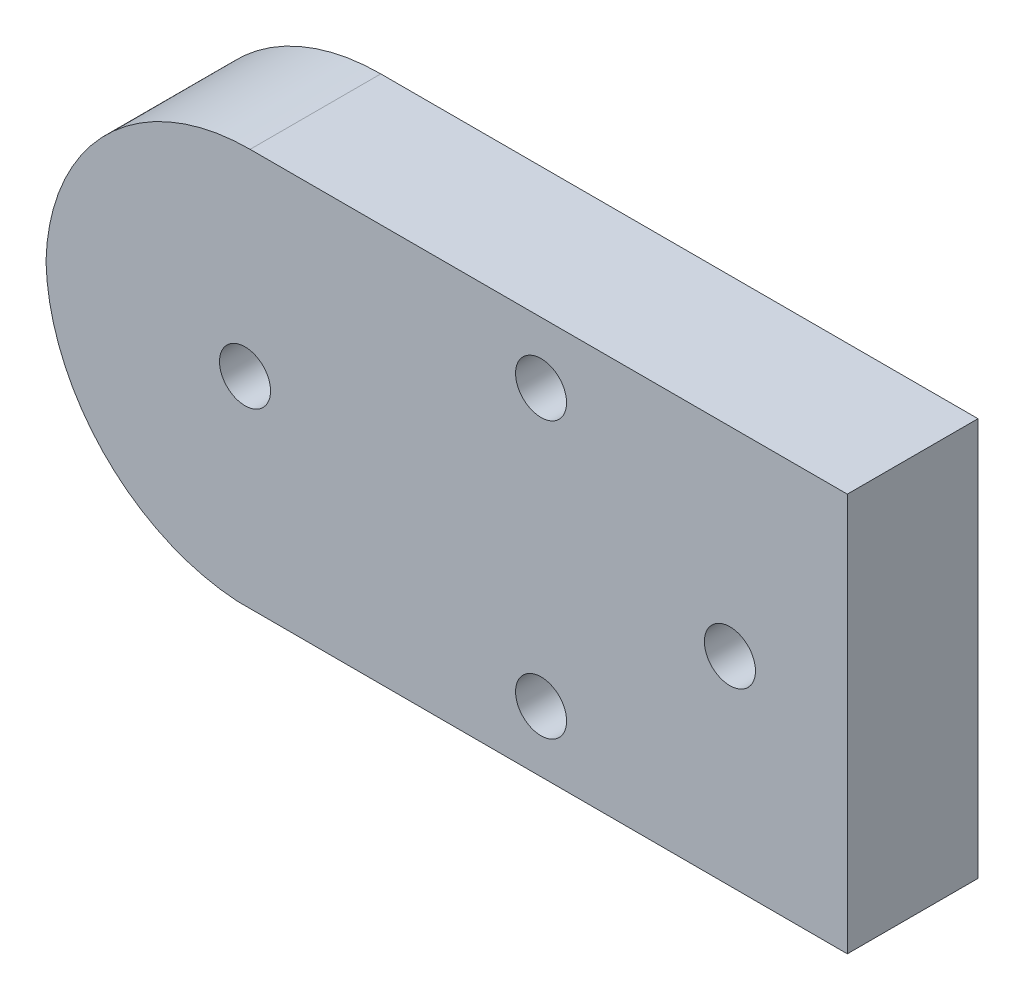
ISO-10303-21;
HEADER;
FILE_DESCRIPTION(('STEP AP214'),'2;1');
FILE_NAME('part.step','',(''),(''),'','','');
FILE_SCHEMA(('AUTOMOTIVE_DESIGN { 1 0 10303 214 1 1 1 1 }'));
ENDSEC;
DATA;
#1=APPLICATION_CONTEXT('core data for automotive mechanical design processes');
#2=APPLICATION_PROTOCOL_DEFINITION('international standard','automotive_design',2000,#1);
#3=PRODUCT_CONTEXT('',#1,'mechanical');
#4=PRODUCT('Part','Part','',(#3));
#5=PRODUCT_RELATED_PRODUCT_CATEGORY('part','',(#4));
#6=PRODUCT_DEFINITION_FORMATION('','',#4);
#7=PRODUCT_DEFINITION_CONTEXT('part definition',#1,'design');
#8=PRODUCT_DEFINITION('design','',#6,#7);
#9=PRODUCT_DEFINITION_SHAPE('','',#8);
#10=(LENGTH_UNIT() NAMED_UNIT(*) SI_UNIT(.MILLI.,.METRE.));
#11=(NAMED_UNIT(*) PLANE_ANGLE_UNIT() SI_UNIT($,.RADIAN.));
#12=(NAMED_UNIT(*) SI_UNIT($,.STERADIAN.) SOLID_ANGLE_UNIT());
#13=UNCERTAINTY_MEASURE_WITH_UNIT(LENGTH_MEASURE(1.E-05),#10,'distance_accuracy_value','');
#14=(GEOMETRIC_REPRESENTATION_CONTEXT(3) GLOBAL_UNCERTAINTY_ASSIGNED_CONTEXT((#13)) GLOBAL_UNIT_ASSIGNED_CONTEXT((#10,
#11,#12)) REPRESENTATION_CONTEXT('',''));
#15=CARTESIAN_POINT('',(0.,0.,0.));
#16=DIRECTION('',(0.,0.,1.));
#17=DIRECTION('',(1.,0.,0.));
#18=AXIS2_PLACEMENT_3D('',#15,#16,#17);
#19=CARTESIAN_POINT('',(0.,0.,4.));
#20=DIRECTION('',(0.,0.,1.));
#21=DIRECTION('',(1.,0.,0.));
#22=AXIS2_PLACEMENT_3D('',#19,#20,#21);
#23=PLANE('',#22);
#24=DIRECTION('',(1.,0.,0.));
#25=VECTOR('',#24,1.);
#26=CARTESIAN_POINT('',(0.,-9.75,4.));
#27=LINE('',#26,#25);
#28=CARTESIAN_POINT('',(0.25,-9.75,4.));
#29=VERTEX_POINT('',#28);
#30=CARTESIAN_POINT('',(29.5,-9.75,4.));
#31=VERTEX_POINT('',#30);
#32=EDGE_CURVE('E205',#29,#31,#27,.T.);
#33=ORIENTED_EDGE('',*,*,#32,.T.);
#34=DIRECTION('',(-0.999999767070476,0.000682538639031551,0.));
#35=VECTOR('',#34,1.);
#36=CARTESIAN_POINT('',(-0.00664100734015322,-9.72986057271339,4.));
#37=LINE('',#36,#35);
#38=CARTESIAN_POINT('',(-0.388423062468493,-9.72959999164838,4.));
#39=VERTEX_POINT('',#38);
#40=EDGE_CURVE('E143',#31,#39,#37,.T.);
#41=ORIENTED_EDGE('',*,*,#40,.T.);
#42=CARTESIAN_POINT('',(0.25,0.250000000000002,4.));
#43=DIRECTION('',(0.,0.,1.));
#44=DIRECTION('',(1.,0.,0.));
#45=AXIS2_PLACEMENT_3D('',#42,#43,#44);
#46=CIRCLE('',#45,10.);
#47=EDGE_CURVE('E57',#39,#29,#46,.T.);
#48=ORIENTED_EDGE('',*,*,#47,.T.);
#49=EDGE_LOOP('',(#33,#41,#48));
#50=FACE_BOUND('',#49,.T.);
#51=ADVANCED_FACE('F47',(#50),#23,.T.);
#52=CARTESIAN_POINT('',(11.2249721603218,-13.75,4.));
#53=DIRECTION('',(0.,0.,-1.));
#54=DIRECTION('',(-1.,0.,0.));
#55=AXIS2_PLACEMENT_3D('',#52,#53,#54);
#56=CYLINDRICAL_SURFACE('',#55,10.);
#57=CARTESIAN_POINT('',(11.2249721603218,-13.75,0.));
#58=DIRECTION('',(0.,0.,1.));
#59=DIRECTION('',(1.,0.,0.));
#60=AXIS2_PLACEMENT_3D('',#57,#58,#59);
#61=CIRCLE('',#60,10.);
#62=CARTESIAN_POINT('',(11.2249721603218,-3.75,0.));
#63=VERTEX_POINT('',#62);
#64=CARTESIAN_POINT('',(4.90104418267572,-6.00352112676056,0.));
#65=VERTEX_POINT('',#64);
#66=EDGE_CURVE('E251',#63,#65,#61,.T.);
#67=ORIENTED_EDGE('',*,*,#66,.T.);
#68=DIRECTION('',(0.,0.,-1.));
#69=VECTOR('',#68,1.);
#70=CARTESIAN_POINT('',(4.90104418267572,-6.00352112676056,4.));
#71=LINE('',#70,#69);
#72=CARTESIAN_POINT('',(4.90104418267572,-6.00352112676056,4.));
#73=VERTEX_POINT('',#72);
#74=EDGE_CURVE('E290',#73,#65,#71,.T.);
#75=ORIENTED_EDGE('',*,*,#74,.F.);
#76=CARTESIAN_POINT('',(11.2249721603218,-13.75,4.));
#77=DIRECTION('',(0.,0.,1.));
#78=DIRECTION('',(1.,0.,0.));
#79=AXIS2_PLACEMENT_3D('',#76,#77,#78);
#80=CIRCLE('',#79,10.);
#81=CARTESIAN_POINT('',(11.2249721603218,-3.75,4.));
#82=VERTEX_POINT('',#81);
#83=EDGE_CURVE('E208',#82,#73,#80,.T.);
#84=ORIENTED_EDGE('',*,*,#83,.F.);
#85=DIRECTION('',(0.,0.,-1.));
#86=VECTOR('',#85,1.);
#87=CARTESIAN_POINT('',(11.2249721603218,-3.75,4.));
#88=LINE('',#87,#86);
#89=EDGE_CURVE('E273',#82,#63,#88,.T.);
#90=ORIENTED_EDGE('',*,*,#89,.T.);
#91=EDGE_LOOP('',(#67,#75,#84,#90));
#92=FACE_BOUND('',#91,.T.);
#93=ADVANCED_FACE('F336',(#92),#56,.T.);
#94=CARTESIAN_POINT('',(0.,0.,4.));
#95=DIRECTION('',(0.,0.,-1.));
#96=DIRECTION('',(-1.,0.,0.));
#97=AXIS2_PLACEMENT_3D('',#94,#95,#96);
#98=CYLINDRICAL_SURFACE('',#97,7.75);
#99=CARTESIAN_POINT('',(0.,0.,0.));
#100=DIRECTION('',(0.,0.,1.));
#101=DIRECTION('',(1.,0.,0.));
#102=AXIS2_PLACEMENT_3D('',#99,#100,#101);
#103=CIRCLE('',#102,7.75);
#104=CARTESIAN_POINT('',(4.90104418267573,6.00352112676056,0.));
#105=VERTEX_POINT('',#104);
#106=EDGE_CURVE('E255',#105,#65,#103,.T.);
#107=ORIENTED_EDGE('',*,*,#106,.F.);
#108=DIRECTION('',(0.,0.,-1.));
#109=VECTOR('',#108,1.);
#110=CARTESIAN_POINT('',(4.90104418267573,6.00352112676056,4.));
#111=LINE('',#110,#109);
#112=CARTESIAN_POINT('',(4.90104418267573,6.00352112676056,4.));
#113=VERTEX_POINT('',#112);
#114=EDGE_CURVE('E287',#113,#105,#111,.T.);
#115=ORIENTED_EDGE('',*,*,#114,.F.);
#116=CARTESIAN_POINT('',(0.,0.,4.));
#117=DIRECTION('',(0.,0.,1.));
#118=DIRECTION('',(1.,0.,0.));
#119=AXIS2_PLACEMENT_3D('',#116,#117,#118);
#120=CIRCLE('',#119,7.75);
#121=EDGE_CURVE('E213',#113,#73,#120,.T.);
#122=ORIENTED_EDGE('',*,*,#121,.T.);
#123=ORIENTED_EDGE('',*,*,#74,.T.);
#124=EDGE_LOOP('',(#107,#115,#122,#123));
#125=FACE_BOUND('',#124,.T.);
#126=ADVANCED_FACE('F354',(#125),#98,.F.);
#127=CARTESIAN_POINT('',(11.2249721603218,13.75,4.));
#128=DIRECTION('',(0.,0.,-1.));
#129=DIRECTION('',(-1.,0.,0.));
#130=AXIS2_PLACEMENT_3D('',#127,#128,#129);
#131=CYLINDRICAL_SURFACE('',#130,10.);
#132=CARTESIAN_POINT('',(11.2249721603218,13.75,0.));
#133=DIRECTION('',(0.,0.,1.));
#134=DIRECTION('',(1.,0.,0.));
#135=AXIS2_PLACEMENT_3D('',#132,#133,#134);
#136=CIRCLE('',#135,10.);
#137=CARTESIAN_POINT('',(11.2249721603218,3.75,0.));
#138=VERTEX_POINT('',#137);
#139=EDGE_CURVE('E259',#105,#138,#136,.T.);
#140=ORIENTED_EDGE('',*,*,#139,.T.);
#141=DIRECTION('',(0.,0.,-1.));
#142=VECTOR('',#141,1.);
#143=CARTESIAN_POINT('',(11.2249721603218,3.75,4.));
#144=LINE('',#143,#142);
#145=CARTESIAN_POINT('',(11.2249721603218,3.75,4.));
#146=VERTEX_POINT('',#145);
#147=EDGE_CURVE('E284',#146,#138,#144,.T.);
#148=ORIENTED_EDGE('',*,*,#147,.F.);
#149=CARTESIAN_POINT('',(11.2249721603218,13.75,4.));
#150=DIRECTION('',(0.,0.,1.));
#151=DIRECTION('',(1.,0.,0.));
#152=AXIS2_PLACEMENT_3D('',#149,#150,#151);
#153=CIRCLE('',#152,10.);
#154=EDGE_CURVE('E217',#113,#146,#153,.T.);
#155=ORIENTED_EDGE('',*,*,#154,.F.);
#156=ORIENTED_EDGE('',*,*,#114,.T.);
#157=EDGE_LOOP('',(#140,#148,#155,#156));
#158=FACE_BOUND('',#157,.T.);
#159=ADVANCED_FACE('F352',(#158),#131,.T.);
#160=CARTESIAN_POINT('',(0.,3.75,4.));
#161=DIRECTION('',(0.,-1.,0.));
#162=DIRECTION('',(0.,0.,-1.));
#163=AXIS2_PLACEMENT_3D('',#160,#161,#162);
#164=PLANE('',#163);
#165=DIRECTION('',(-1.,0.,0.));
#166=VECTOR('',#165,1.);
#167=CARTESIAN_POINT('',(0.,3.75,0.));
#168=LINE('',#167,#166);
#169=CARTESIAN_POINT('',(23.75,3.75,0.));
#170=VERTEX_POINT('',#169);
#171=EDGE_CURVE('E263',#170,#138,#168,.T.);
#172=ORIENTED_EDGE('',*,*,#171,.F.);
#173=DIRECTION('',(0.,0.,-1.));
#174=VECTOR('',#173,1.);
#175=CARTESIAN_POINT('',(23.75,3.75,4.));
#176=LINE('',#175,#174);
#177=CARTESIAN_POINT('',(23.75,3.75,4.));
#178=VERTEX_POINT('',#177);
#179=EDGE_CURVE('E281',#178,#170,#176,.T.);
#180=ORIENTED_EDGE('',*,*,#179,.F.);
#181=DIRECTION('',(-1.,0.,0.));
#182=VECTOR('',#181,1.);
#183=CARTESIAN_POINT('',(0.,3.75,4.));
#184=LINE('',#183,#182);
#185=EDGE_CURVE('E221',#178,#146,#184,.T.);
#186=ORIENTED_EDGE('',*,*,#185,.T.);
#187=ORIENTED_EDGE('',*,*,#147,.T.);
#188=EDGE_LOOP('',(#172,#180,#186,#187));
#189=FACE_BOUND('',#188,.T.);
#190=ADVANCED_FACE('F349',(#189),#164,.T.);
#191=CARTESIAN_POINT('',(23.75,0.,4.));
#192=DIRECTION('',(0.,0.,-1.));
#193=DIRECTION('',(-1.,0.,0.));
#194=AXIS2_PLACEMENT_3D('',#191,#192,#193);
#195=CYLINDRICAL_SURFACE('',#194,3.75);
#196=CARTESIAN_POINT('',(23.75,0.,0.));
#197=DIRECTION('',(0.,0.,1.));
#198=DIRECTION('',(1.,0.,0.));
#199=AXIS2_PLACEMENT_3D('',#196,#197,#198);
#200=CIRCLE('',#199,3.75);
#201=CARTESIAN_POINT('',(23.75,-3.75,0.));
#202=VERTEX_POINT('',#201);
#203=EDGE_CURVE('E267',#202,#170,#200,.T.);
#204=ORIENTED_EDGE('',*,*,#203,.F.);
#205=DIRECTION('',(0.,0.,-1.));
#206=VECTOR('',#205,1.);
#207=CARTESIAN_POINT('',(23.75,-3.75,4.));
#208=LINE('',#207,#206);
#209=CARTESIAN_POINT('',(23.75,-3.75,4.));
#210=VERTEX_POINT('',#209);
#211=EDGE_CURVE('E277',#210,#202,#208,.T.);
#212=ORIENTED_EDGE('',*,*,#211,.F.);
#213=CARTESIAN_POINT('',(23.75,0.,4.));
#214=DIRECTION('',(0.,0.,1.));
#215=DIRECTION('',(1.,0.,0.));
#216=AXIS2_PLACEMENT_3D('',#213,#214,#215);
#217=CIRCLE('',#216,3.75);
#218=EDGE_CURVE('E225',#210,#178,#217,.T.);
#219=ORIENTED_EDGE('',*,*,#218,.T.);
#220=ORIENTED_EDGE('',*,*,#179,.T.);
#221=EDGE_LOOP('',(#204,#212,#219,#220));
#222=FACE_BOUND('',#221,.T.);
#223=ADVANCED_FACE('F346',(#222),#195,.F.);
#224=CARTESIAN_POINT('',(0.,-9.75,4.));
#225=DIRECTION('',(0.,1.,0.));
#226=DIRECTION('',(0.,0.,1.));
#227=AXIS2_PLACEMENT_3D('',#224,#225,#226);
#228=PLANE('',#227);
#229=ORIENTED_EDGE('',*,*,#32,.F.);
#230=DIRECTION('',(0.,0.,-1.));
#231=VECTOR('',#230,1.);
#232=CARTESIAN_POINT('',(0.25,-9.75,0.));
#233=LINE('',#232,#231);
#234=CARTESIAN_POINT('',(0.25,-9.75,0.));
#235=VERTEX_POINT('',#234);
#236=EDGE_CURVE('E293',#29,#235,#233,.T.);
#237=ORIENTED_EDGE('',*,*,#236,.T.);
#238=DIRECTION('',(1.,0.,0.));
#239=VECTOR('',#238,1.);
#240=CARTESIAN_POINT('',(0.,-9.75,0.));
#241=LINE('',#240,#239);
#242=CARTESIAN_POINT('',(29.5,-9.75,0.));
#243=VERTEX_POINT('',#242);
#244=EDGE_CURVE('E241',#235,#243,#241,.T.);
#245=ORIENTED_EDGE('',*,*,#244,.T.);
#246=DIRECTION('',(0.,0.,-1.));
#247=VECTOR('',#246,1.);
#248=CARTESIAN_POINT('',(29.5,-9.75,4.));
#249=LINE('',#248,#247);
#250=EDGE_CURVE('E278',#31,#243,#249,.T.);
#251=ORIENTED_EDGE('',*,*,#250,.F.);
#252=EDGE_LOOP('',(#229,#237,#245,#251));
#253=FACE_BOUND('',#252,.T.);
#254=ADVANCED_FACE('F314',(#253),#228,.F.);
#255=CARTESIAN_POINT('',(29.5,0.,4.));
#256=DIRECTION('',(1.,0.,0.));
#257=DIRECTION('',(0.,0.,-1.));
#258=AXIS2_PLACEMENT_3D('',#255,#256,#257);
#259=PLANE('',#258);
#260=DIRECTION('',(0.,-1.,0.));
#261=VECTOR('',#260,1.);
#262=CARTESIAN_POINT('',(29.5,0.,0.));
#263=LINE('',#262,#261);
#264=CARTESIAN_POINT('',(29.5,9.75,0.));
#265=VERTEX_POINT('',#264);
#266=EDGE_CURVE('E244',#265,#243,#263,.T.);
#267=ORIENTED_EDGE('',*,*,#266,.F.);
#268=DIRECTION('',(0.,0.,-1.));
#269=VECTOR('',#268,1.);
#270=CARTESIAN_POINT('',(29.5,9.75,4.));
#271=LINE('',#270,#269);
#272=CARTESIAN_POINT('',(29.5,9.75,6.4));
#273=VERTEX_POINT('',#272);
#274=EDGE_CURVE('E155',#273,#265,#271,.T.);
#275=ORIENTED_EDGE('',*,*,#274,.F.);
#276=DIRECTION('',(0.,1.,0.));
#277=VECTOR('',#276,1.);
#278=CARTESIAN_POINT('',(29.5,0.,6.4));
#279=LINE('',#278,#277);
#280=CARTESIAN_POINT('',(29.5,-9.75,6.4));
#281=VERTEX_POINT('',#280);
#282=EDGE_CURVE('E151',#281,#273,#279,.T.);
#283=ORIENTED_EDGE('',*,*,#282,.F.);
#284=DIRECTION('',(0.,0.,-1.));
#285=VECTOR('',#284,1.);
#286=CARTESIAN_POINT('',(29.5,-9.75,5.2));
#287=LINE('',#286,#285);
#288=EDGE_CURVE('E138',#281,#31,#287,.T.);
#289=ORIENTED_EDGE('',*,*,#288,.T.);
#290=ORIENTED_EDGE('',*,*,#250,.T.);
#291=EDGE_LOOP('',(#267,#275,#283,#289,#290));
#292=FACE_BOUND('',#291,.T.);
#293=ADVANCED_FACE('F153',(#292),#259,.T.);
#294=CARTESIAN_POINT('',(0.,9.75,4.));
#295=DIRECTION('',(0.,1.,0.));
#296=DIRECTION('',(0.,0.,1.));
#297=AXIS2_PLACEMENT_3D('',#294,#295,#296);
#298=PLANE('',#297);
#299=DIRECTION('',(1.,0.,0.));
#300=VECTOR('',#299,1.);
#301=CARTESIAN_POINT('',(0.,9.75,0.));
#302=LINE('',#301,#300);
#303=CARTESIAN_POINT('',(0.25,9.75,0.));
#304=VERTEX_POINT('',#303);
#305=EDGE_CURVE('E248',#304,#265,#302,.T.);
#306=ORIENTED_EDGE('',*,*,#305,.F.);
#307=DIRECTION('',(0.,0.,-1.));
#308=VECTOR('',#307,1.);
#309=CARTESIAN_POINT('',(0.25,9.75,4.));
#310=LINE('',#309,#308);
#311=CARTESIAN_POINT('',(0.250000000000001,9.75,6.4));
#312=VERTEX_POINT('',#311);
#313=EDGE_CURVE('E11',#304,#312,#310,.F.);
#314=ORIENTED_EDGE('',*,*,#313,.T.);
#315=DIRECTION('',(-1.,0.,0.));
#316=VECTOR('',#315,1.);
#317=CARTESIAN_POINT('',(0.,9.75,6.4));
#318=LINE('',#317,#316);
#319=EDGE_CURVE('E160',#273,#312,#318,.T.);
#320=ORIENTED_EDGE('',*,*,#319,.F.);
#321=ORIENTED_EDGE('',*,*,#274,.T.);
#322=EDGE_LOOP('',(#306,#314,#320,#321));
#323=FACE_BOUND('',#322,.T.);
#324=ADVANCED_FACE('F323',(#323),#298,.T.);
#325=CARTESIAN_POINT('',(14.5,6.75,4.));
#326=DIRECTION('',(0.,0.,-1.));
#327=DIRECTION('',(-1.,0.,0.));
#328=AXIS2_PLACEMENT_3D('',#325,#326,#327);
#329=CYLINDRICAL_SURFACE('',#328,1.25);
#330=CARTESIAN_POINT('',(14.5,6.75,0.));
#331=DIRECTION('',(0.,0.,1.));
#332=DIRECTION('',(1.,0.,0.));
#333=AXIS2_PLACEMENT_3D('',#330,#331,#332);
#334=CIRCLE('',#333,1.25);
#335=CARTESIAN_POINT('',(15.75,6.75,0.));
#336=VERTEX_POINT('',#335);
#337=EDGE_CURVE('E237',#336,#336,#334,.T.);
#338=ORIENTED_EDGE('',*,*,#337,.F.);
#339=EDGE_LOOP('',(#338));
#340=FACE_BOUND('',#339,.T.);
#341=CARTESIAN_POINT('',(14.5,6.75,6.4));
#342=DIRECTION('',(0.,0.,1.));
#343=DIRECTION('',(1.,0.,0.));
#344=AXIS2_PLACEMENT_3D('',#341,#342,#343);
#345=CIRCLE('',#344,1.25);
#346=CARTESIAN_POINT('',(15.75,6.75,6.4));
#347=VERTEX_POINT('',#346);
#348=EDGE_CURVE('E190',#347,#347,#345,.F.);
#349=ORIENTED_EDGE('',*,*,#348,.F.);
#350=EDGE_LOOP('',(#349));
#351=FACE_BOUND('',#350,.T.);
#352=ADVANCED_FACE('F402',(#340,#351),#329,.F.);
#353=CARTESIAN_POINT('',(14.5,-6.75,4.));
#354=DIRECTION('',(0.,0.,-1.));
#355=DIRECTION('',(-1.,0.,0.));
#356=AXIS2_PLACEMENT_3D('',#353,#354,#355);
#357=CYLINDRICAL_SURFACE('',#356,1.25);
#358=CARTESIAN_POINT('',(14.5,-6.75,0.));
#359=DIRECTION('',(0.,0.,1.));
#360=DIRECTION('',(1.,0.,0.));
#361=AXIS2_PLACEMENT_3D('',#358,#359,#360);
#362=CIRCLE('',#361,1.25);
#363=CARTESIAN_POINT('',(15.75,-6.75,0.));
#364=VERTEX_POINT('',#363);
#365=EDGE_CURVE('E233',#364,#364,#362,.T.);
#366=ORIENTED_EDGE('',*,*,#365,.F.);
#367=EDGE_LOOP('',(#366));
#368=FACE_BOUND('',#367,.T.);
#369=CARTESIAN_POINT('',(14.5,-6.75,6.4));
#370=DIRECTION('',(0.,0.,1.));
#371=DIRECTION('',(1.,0.,0.));
#372=AXIS2_PLACEMENT_3D('',#369,#370,#371);
#373=CIRCLE('',#372,1.25);
#374=CARTESIAN_POINT('',(15.75,-6.75,6.4));
#375=VERTEX_POINT('',#374);
#376=EDGE_CURVE('E182',#375,#375,#373,.F.);
#377=ORIENTED_EDGE('',*,*,#376,.F.);
#378=EDGE_LOOP('',(#377));
#379=FACE_BOUND('',#378,.T.);
#380=ADVANCED_FACE('F372',(#368,#379),#357,.F.);
#381=CARTESIAN_POINT('',(0.,-3.75,4.));
#382=DIRECTION('',(0.,-1.,0.));
#383=DIRECTION('',(0.,0.,-1.));
#384=AXIS2_PLACEMENT_3D('',#381,#382,#383);
#385=PLANE('',#384);
#386=DIRECTION('',(-1.,0.,0.));
#387=VECTOR('',#386,1.);
#388=CARTESIAN_POINT('',(0.,-3.75,0.));
#389=LINE('',#388,#387);
#390=EDGE_CURVE('E209',#202,#63,#389,.T.);
#391=ORIENTED_EDGE('',*,*,#390,.T.);
#392=ORIENTED_EDGE('',*,*,#89,.F.);
#393=DIRECTION('',(-1.,0.,0.));
#394=VECTOR('',#393,1.);
#395=CARTESIAN_POINT('',(0.,-3.75,4.));
#396=LINE('',#395,#394);
#397=EDGE_CURVE('E229',#210,#82,#396,.T.);
#398=ORIENTED_EDGE('',*,*,#397,.F.);
#399=ORIENTED_EDGE('',*,*,#211,.T.);
#400=EDGE_LOOP('',(#391,#392,#398,#399));
#401=FACE_BOUND('',#400,.T.);
#402=ADVANCED_FACE('F327',(#401),#385,.F.);
#403=CARTESIAN_POINT('',(0.,0.,0.));
#404=DIRECTION('',(0.,0.,1.));
#405=DIRECTION('',(1.,0.,0.));
#406=AXIS2_PLACEMENT_3D('',#403,#404,#405);
#407=PLANE('',#406);
#408=ORIENTED_EDGE('',*,*,#365,.T.);
#409=EDGE_LOOP('',(#408));
#410=FACE_BOUND('',#409,.T.);
#411=ORIENTED_EDGE('',*,*,#337,.T.);
#412=EDGE_LOOP('',(#411));
#413=FACE_BOUND('',#412,.T.);
#414=ORIENTED_EDGE('',*,*,#244,.F.);
#415=CARTESIAN_POINT('',(0.25,0.250000000000002,0.));
#416=DIRECTION('',(0.,0.,1.));
#417=DIRECTION('',(1.,0.,0.));
#418=AXIS2_PLACEMENT_3D('',#415,#416,#417);
#419=CIRCLE('',#418,10.);
#420=CARTESIAN_POINT('',(-9.7468745115661,0.,0.));
#421=VERTEX_POINT('',#420);
#422=EDGE_CURVE('E72',#235,#421,#419,.F.);
#423=ORIENTED_EDGE('',*,*,#422,.T.);
#424=CARTESIAN_POINT('',(0.25,-0.250000000000002,0.));
#425=DIRECTION('',(0.,0.,1.));
#426=DIRECTION('',(1.,0.,0.));
#427=AXIS2_PLACEMENT_3D('',#424,#425,#426);
#428=CIRCLE('',#427,10.);
#429=EDGE_CURVE('E301',#421,#304,#428,.F.);
#430=ORIENTED_EDGE('',*,*,#429,.T.);
#431=ORIENTED_EDGE('',*,*,#305,.T.);
#432=ORIENTED_EDGE('',*,*,#266,.T.);
#433=EDGE_LOOP('',(#414,#423,#430,#431,#432));
#434=FACE_BOUND('',#433,.T.);
#435=ORIENTED_EDGE('',*,*,#66,.F.);
#436=ORIENTED_EDGE('',*,*,#390,.F.);
#437=ORIENTED_EDGE('',*,*,#203,.T.);
#438=ORIENTED_EDGE('',*,*,#171,.T.);
#439=ORIENTED_EDGE('',*,*,#139,.F.);
#440=ORIENTED_EDGE('',*,*,#106,.T.);
#441=EDGE_LOOP('',(#435,#436,#437,#438,#439,#440));
#442=FACE_BOUND('',#441,.T.);
#443=ADVANCED_FACE('F324',(#410,#413,#434,#442),#407,.F.);
#444=CARTESIAN_POINT('',(0.25,-0.250000000000002,4.));
#445=DIRECTION('',(0.,0.,-1.));
#446=DIRECTION('',(-1.,0.,0.));
#447=AXIS2_PLACEMENT_3D('',#444,#445,#446);
#448=CYLINDRICAL_SURFACE('',#447,10.);
#449=DIRECTION('',(0.,0.,-1.));
#450=VECTOR('',#449,1.);
#451=CARTESIAN_POINT('',(-9.7468745115661,0.,2.));
#452=LINE('',#451,#450);
#453=CARTESIAN_POINT('',(-9.7468745115661,0.,6.4));
#454=VERTEX_POINT('',#453);
#455=EDGE_CURVE('E51',#454,#421,#452,.T.);
#456=ORIENTED_EDGE('',*,*,#455,.F.);
#457=CARTESIAN_POINT('',(0.25,-0.250000000000002,6.4));
#458=DIRECTION('',(0.,0.,1.));
#459=DIRECTION('',(1.,0.,0.));
#460=AXIS2_PLACEMENT_3D('',#457,#458,#459);
#461=CIRCLE('',#460,10.);
#462=EDGE_CURVE('E177',#312,#454,#461,.T.);
#463=ORIENTED_EDGE('',*,*,#462,.F.);
#464=ORIENTED_EDGE('',*,*,#313,.F.);
#465=ORIENTED_EDGE('',*,*,#429,.F.);
#466=EDGE_LOOP('',(#456,#463,#464,#465));
#467=FACE_BOUND('',#466,.T.);
#468=ADVANCED_FACE('F49',(#467),#448,.T.);
#469=CARTESIAN_POINT('',(0.25,0.250000000000002,4.));
#470=DIRECTION('',(0.,0.,1.));
#471=DIRECTION('',(1.,0.,0.));
#472=AXIS2_PLACEMENT_3D('',#469,#470,#471);
#473=CYLINDRICAL_SURFACE('',#472,10.);
#474=ORIENTED_EDGE('',*,*,#47,.F.);
#475=DIRECTION('',(0.,0.,-1.));
#476=VECTOR('',#475,1.);
#477=CARTESIAN_POINT('',(-0.388423062468493,-9.72959999164838,5.2));
#478=LINE('',#477,#476);
#479=CARTESIAN_POINT('',(-0.388423062468493,-9.72959999164838,6.4));
#480=VERTEX_POINT('',#479);
#481=EDGE_CURVE('E64',#480,#39,#478,.T.);
#482=ORIENTED_EDGE('',*,*,#481,.F.);
#483=CARTESIAN_POINT('',(0.25,0.250000000000002,6.4));
#484=DIRECTION('',(0.,0.,1.));
#485=DIRECTION('',(1.,0.,0.));
#486=AXIS2_PLACEMENT_3D('',#483,#484,#485);
#487=CIRCLE('',#486,10.);
#488=EDGE_CURVE('E167',#454,#480,#487,.T.);
#489=ORIENTED_EDGE('',*,*,#488,.F.);
#490=ORIENTED_EDGE('',*,*,#455,.T.);
#491=ORIENTED_EDGE('',*,*,#422,.F.);
#492=ORIENTED_EDGE('',*,*,#236,.F.);
#493=EDGE_LOOP('',(#474,#482,#489,#490,#491,#492));
#494=FACE_BOUND('',#493,.T.);
#495=ADVANCED_FACE('F315',(#494),#473,.T.);
#496=CARTESIAN_POINT('',(0.,0.,4.));
#497=DIRECTION('',(0.,0.,1.));
#498=DIRECTION('',(1.,0.,0.));
#499=AXIS2_PLACEMENT_3D('',#496,#497,#498);
#500=PLANE('',#499);
#501=CARTESIAN_POINT('',(23.75,0.,4.));
#502=DIRECTION('',(0.,0.,1.));
#503=DIRECTION('',(1.,0.,0.));
#504=AXIS2_PLACEMENT_3D('',#501,#502,#503);
#505=CIRCLE('',#504,1.25);
#506=CARTESIAN_POINT('',(25.,0.,4.));
#507=VERTEX_POINT('',#506);
#508=EDGE_CURVE('E148',#507,#507,#505,.T.);
#509=ORIENTED_EDGE('',*,*,#508,.T.);
#510=EDGE_LOOP('',(#509));
#511=FACE_BOUND('',#510,.T.);
#512=CARTESIAN_POINT('',(0.,0.,4.));
#513=DIRECTION('',(0.,0.,1.));
#514=DIRECTION('',(1.,0.,0.));
#515=AXIS2_PLACEMENT_3D('',#512,#513,#514);
#516=CIRCLE('',#515,1.25);
#517=CARTESIAN_POINT('',(1.25,0.,4.));
#518=VERTEX_POINT('',#517);
#519=EDGE_CURVE('E196',#518,#518,#516,.T.);
#520=ORIENTED_EDGE('',*,*,#519,.T.);
#521=EDGE_LOOP('',(#520));
#522=FACE_BOUND('',#521,.T.);
#523=ORIENTED_EDGE('',*,*,#397,.T.);
#524=ORIENTED_EDGE('',*,*,#83,.T.);
#525=ORIENTED_EDGE('',*,*,#121,.F.);
#526=ORIENTED_EDGE('',*,*,#154,.T.);
#527=ORIENTED_EDGE('',*,*,#185,.F.);
#528=ORIENTED_EDGE('',*,*,#218,.F.);
#529=EDGE_LOOP('',(#523,#524,#525,#526,#527,#528));
#530=FACE_BOUND('',#529,.T.);
#531=ADVANCED_FACE('F342',(#511,#522,#530),#500,.F.);
#532=CARTESIAN_POINT('',(-0.00664100734015322,-9.72986057271339,5.2));
#533=DIRECTION('',(-0.000682538639031551,-0.999999767070476,0.));
#534=DIRECTION('',(0.999999767070476,-0.000682538639031551,0.));
#535=AXIS2_PLACEMENT_3D('',#532,#533,#534);
#536=PLANE('',#535);
#537=ORIENTED_EDGE('',*,*,#40,.F.);
#538=ORIENTED_EDGE('',*,*,#288,.F.);
#539=DIRECTION('',(0.999999767070476,-0.000682538639031551,0.));
#540=VECTOR('',#539,1.);
#541=CARTESIAN_POINT('',(-0.00664100734015322,-9.72986057271339,6.4));
#542=LINE('',#541,#540);
#543=EDGE_CURVE('E142',#480,#281,#542,.T.);
#544=ORIENTED_EDGE('',*,*,#543,.F.);
#545=ORIENTED_EDGE('',*,*,#481,.T.);
#546=EDGE_LOOP('',(#537,#538,#544,#545));
#547=FACE_BOUND('',#546,.T.);
#548=ADVANCED_FACE('F140',(#547),#536,.T.);
#549=CARTESIAN_POINT('',(0.,0.,5.2));
#550=DIRECTION('',(0.,0.,-1.));
#551=DIRECTION('',(-1.,0.,0.));
#552=AXIS2_PLACEMENT_3D('',#549,#550,#551);
#553=CYLINDRICAL_SURFACE('',#552,1.25);
#554=ORIENTED_EDGE('',*,*,#519,.F.);
#555=EDGE_LOOP('',(#554));
#556=FACE_BOUND('',#555,.T.);
#557=CARTESIAN_POINT('',(0.,0.,6.4));
#558=DIRECTION('',(0.,0.,1.));
#559=DIRECTION('',(1.,0.,0.));
#560=AXIS2_PLACEMENT_3D('',#557,#558,#559);
#561=CIRCLE('',#560,1.25);
#562=CARTESIAN_POINT('',(1.25,0.,6.4));
#563=VERTEX_POINT('',#562);
#564=EDGE_CURVE('E169',#563,#563,#561,.F.);
#565=ORIENTED_EDGE('',*,*,#564,.F.);
#566=EDGE_LOOP('',(#565));
#567=FACE_BOUND('',#566,.T.);
#568=ADVANCED_FACE('F448',(#556,#567),#553,.F.);
#569=CARTESIAN_POINT('',(23.75,0.,5.2));
#570=DIRECTION('',(0.,0.,-1.));
#571=DIRECTION('',(-1.,0.,0.));
#572=AXIS2_PLACEMENT_3D('',#569,#570,#571);
#573=CYLINDRICAL_SURFACE('',#572,1.25);
#574=ORIENTED_EDGE('',*,*,#508,.F.);
#575=EDGE_LOOP('',(#574));
#576=FACE_BOUND('',#575,.T.);
#577=CARTESIAN_POINT('',(23.75,0.,6.4));
#578=DIRECTION('',(0.,0.,1.));
#579=DIRECTION('',(1.,0.,0.));
#580=AXIS2_PLACEMENT_3D('',#577,#578,#579);
#581=CIRCLE('',#580,1.25);
#582=CARTESIAN_POINT('',(25.,0.,6.4));
#583=VERTEX_POINT('',#582);
#584=EDGE_CURVE('E186',#583,#583,#581,.F.);
#585=ORIENTED_EDGE('',*,*,#584,.F.);
#586=EDGE_LOOP('',(#585));
#587=FACE_BOUND('',#586,.T.);
#588=ADVANCED_FACE('F454',(#576,#587),#573,.F.);
#589=CARTESIAN_POINT('',(0.,0.,6.4));
#590=DIRECTION('',(0.,0.,1.));
#591=DIRECTION('',(1.,0.,0.));
#592=AXIS2_PLACEMENT_3D('',#589,#590,#591);
#593=PLANE('',#592);
#594=ORIENTED_EDGE('',*,*,#564,.T.);
#595=EDGE_LOOP('',(#594));
#596=FACE_BOUND('',#595,.T.);
#597=ORIENTED_EDGE('',*,*,#543,.T.);
#598=ORIENTED_EDGE('',*,*,#282,.T.);
#599=ORIENTED_EDGE('',*,*,#319,.T.);
#600=ORIENTED_EDGE('',*,*,#462,.T.);
#601=ORIENTED_EDGE('',*,*,#488,.T.);
#602=EDGE_LOOP('',(#597,#598,#599,#600,#601));
#603=FACE_BOUND('',#602,.T.);
#604=ORIENTED_EDGE('',*,*,#376,.T.);
#605=EDGE_LOOP('',(#604));
#606=FACE_BOUND('',#605,.T.);
#607=ORIENTED_EDGE('',*,*,#584,.T.);
#608=EDGE_LOOP('',(#607));
#609=FACE_BOUND('',#608,.T.);
#610=ORIENTED_EDGE('',*,*,#348,.T.);
#611=EDGE_LOOP('',(#610));
#612=FACE_BOUND('',#611,.T.);
#613=ADVANCED_FACE('F163',(#596,#603,#606,#609,#612),#593,.T.);
#614=CLOSED_SHELL('',(#51,#93,#126,#159,#190,#223,#254,#293,#324,#352,#380,#402,#443,#468,#495,
#531,#548,#568,#588,#613));
#615=MANIFOLD_SOLID_BREP('B2',#614);
#616=ADVANCED_BREP_SHAPE_REPRESENTATION('',(#18,#615),#14);
#617=SHAPE_DEFINITION_REPRESENTATION(#9,#616);
ENDSEC;
END-ISO-10303-21;
